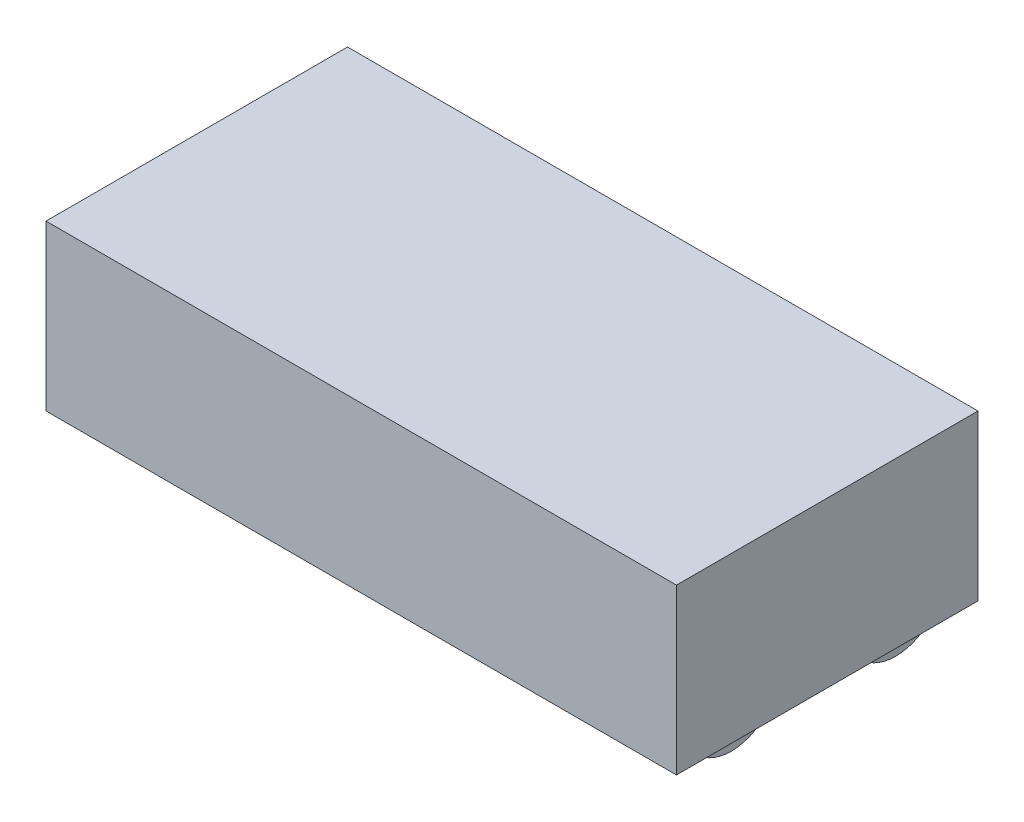
ISO-10303-21;
HEADER;
FILE_DESCRIPTION(('STEP AP214'),'2;1');
FILE_NAME('part.step','',(''),(''),'','','');
FILE_SCHEMA(('AUTOMOTIVE_DESIGN { 1 0 10303 214 1 1 1 1 }'));
ENDSEC;
DATA;
#1=APPLICATION_CONTEXT('core data for automotive mechanical design processes');
#2=APPLICATION_PROTOCOL_DEFINITION('international standard','automotive_design',2000,#1);
#3=PRODUCT_CONTEXT('',#1,'mechanical');
#4=PRODUCT('Part','Part','',(#3));
#5=PRODUCT_RELATED_PRODUCT_CATEGORY('part','',(#4));
#6=PRODUCT_DEFINITION_FORMATION('','',#4);
#7=PRODUCT_DEFINITION_CONTEXT('part definition',#1,'design');
#8=PRODUCT_DEFINITION('design','',#6,#7);
#9=PRODUCT_DEFINITION_SHAPE('','',#8);
#10=(LENGTH_UNIT() NAMED_UNIT(*) SI_UNIT(.MILLI.,.METRE.));
#11=(NAMED_UNIT(*) PLANE_ANGLE_UNIT() SI_UNIT($,.RADIAN.));
#12=(NAMED_UNIT(*) SI_UNIT($,.STERADIAN.) SOLID_ANGLE_UNIT());
#13=UNCERTAINTY_MEASURE_WITH_UNIT(LENGTH_MEASURE(1.E-05),#10,'distance_accuracy_value','');
#14=(GEOMETRIC_REPRESENTATION_CONTEXT(3) GLOBAL_UNCERTAINTY_ASSIGNED_CONTEXT((#13)) GLOBAL_UNIT_ASSIGNED_CONTEXT((#10,
#11,#12)) REPRESENTATION_CONTEXT('',''));
#15=CARTESIAN_POINT('',(0.,0.,0.));
#16=DIRECTION('',(0.,0.,1.));
#17=DIRECTION('',(1.,0.,0.));
#18=AXIS2_PLACEMENT_3D('',#15,#16,#17);
#19=CARTESIAN_POINT('',(0.,0.,0.));
#20=DIRECTION('',(0.,-1.,0.));
#21=DIRECTION('',(0.,0.,-1.));
#22=AXIS2_PLACEMENT_3D('',#19,#20,#21);
#23=PLANE('',#22);
#24=DIRECTION('',(0.,0.,-1.));
#25=VECTOR('',#24,1.);
#26=CARTESIAN_POINT('',(-292.1,0.,139.7));
#27=LINE('',#26,#25);
#28=CARTESIAN_POINT('',(-292.1,0.,139.7));
#29=VERTEX_POINT('',#28);
#30=CARTESIAN_POINT('',(-292.1,0.,-139.7));
#31=VERTEX_POINT('',#30);
#32=EDGE_CURVE('E190',#29,#31,#27,.T.);
#33=ORIENTED_EDGE('',*,*,#32,.T.);
#34=DIRECTION('',(1.,0.,0.));
#35=VECTOR('',#34,1.);
#36=CARTESIAN_POINT('',(-292.1,0.,-139.7));
#37=LINE('',#36,#35);
#38=CARTESIAN_POINT('',(292.1,0.,-139.7));
#39=VERTEX_POINT('',#38);
#40=EDGE_CURVE('E187',#31,#39,#37,.T.);
#41=ORIENTED_EDGE('',*,*,#40,.T.);
#42=DIRECTION('',(0.,0.,-1.));
#43=VECTOR('',#42,1.);
#44=CARTESIAN_POINT('',(292.1,0.,139.7));
#45=LINE('',#44,#43);
#46=CARTESIAN_POINT('',(292.1,0.,139.7));
#47=VERTEX_POINT('',#46);
#48=EDGE_CURVE('E184',#47,#39,#45,.T.);
#49=ORIENTED_EDGE('',*,*,#48,.F.);
#50=DIRECTION('',(1.,0.,0.));
#51=VECTOR('',#50,1.);
#52=CARTESIAN_POINT('',(-292.1,0.,139.7));
#53=LINE('',#52,#51);
#54=EDGE_CURVE('E181',#29,#47,#53,.T.);
#55=ORIENTED_EDGE('',*,*,#54,.F.);
#56=EDGE_LOOP('',(#33,#41,#49,#55));
#57=FACE_BOUND('',#56,.T.);
#58=DIRECTION('',(-1.,0.,0.));
#59=VECTOR('',#58,1.);
#60=CARTESIAN_POINT('',(-279.4,0.,39.7220271944835));
#61=LINE('',#60,#59);
#62=CARTESIAN_POINT('',(-234.95,0.,39.7220271944835));
#63=VERTEX_POINT('',#62);
#64=CARTESIAN_POINT('',(-279.4,0.,39.7220271944835));
#65=VERTEX_POINT('',#64);
#66=EDGE_CURVE('E165',#63,#65,#61,.T.);
#67=ORIENTED_EDGE('',*,*,#66,.T.);
#68=DIRECTION('',(0.,0.,1.));
#69=VECTOR('',#68,1.);
#70=CARTESIAN_POINT('',(-279.4,0.,0.));
#71=LINE('',#70,#69);
#72=CARTESIAN_POINT('',(-279.4,0.,112.677972805516));
#73=VERTEX_POINT('',#72);
#74=EDGE_CURVE('E159',#65,#73,#71,.T.);
#75=ORIENTED_EDGE('',*,*,#74,.T.);
#76=DIRECTION('',(-1.,0.,0.));
#77=VECTOR('',#76,1.);
#78=CARTESIAN_POINT('',(-279.4,0.,112.677972805516));
#79=LINE('',#78,#77);
#80=CARTESIAN_POINT('',(-234.95,0.,112.677972805516));
#81=VERTEX_POINT('',#80);
#82=EDGE_CURVE('E162',#73,#81,#79,.F.);
#83=ORIENTED_EDGE('',*,*,#82,.T.);
#84=DIRECTION('',(0.,0.,-1.));
#85=VECTOR('',#84,1.);
#86=CARTESIAN_POINT('',(-234.95,0.,0.));
#87=LINE('',#86,#85);
#88=EDGE_CURVE('E168',#81,#63,#87,.T.);
#89=ORIENTED_EDGE('',*,*,#88,.T.);
#90=EDGE_LOOP('',(#67,#75,#83,#89));
#91=FACE_BOUND('',#90,.T.);
#92=DIRECTION('',(-1.,0.,0.));
#93=VECTOR('',#92,1.);
#94=CARTESIAN_POINT('',(-279.4,0.,-112.677972805516));
#95=LINE('',#94,#93);
#96=CARTESIAN_POINT('',(-234.95,0.,-112.677972805516));
#97=VERTEX_POINT('',#96);
#98=CARTESIAN_POINT('',(-279.4,0.,-112.677972805516));
#99=VERTEX_POINT('',#98);
#100=EDGE_CURVE('E153',#97,#99,#95,.T.);
#101=ORIENTED_EDGE('',*,*,#100,.T.);
#102=DIRECTION('',(0.,0.,1.));
#103=VECTOR('',#102,1.);
#104=CARTESIAN_POINT('',(-279.4,0.,0.));
#105=LINE('',#104,#103);
#106=CARTESIAN_POINT('',(-279.4,0.,-39.7220271944835));
#107=VERTEX_POINT('',#106);
#108=EDGE_CURVE('E147',#99,#107,#105,.T.);
#109=ORIENTED_EDGE('',*,*,#108,.T.);
#110=DIRECTION('',(-1.,0.,0.));
#111=VECTOR('',#110,1.);
#112=CARTESIAN_POINT('',(-279.4,0.,-39.7220271944835));
#113=LINE('',#112,#111);
#114=CARTESIAN_POINT('',(-234.95,0.,-39.7220271944835));
#115=VERTEX_POINT('',#114);
#116=EDGE_CURVE('E150',#107,#115,#113,.F.);
#117=ORIENTED_EDGE('',*,*,#116,.T.);
#118=DIRECTION('',(0.,0.,-1.));
#119=VECTOR('',#118,1.);
#120=CARTESIAN_POINT('',(-234.95,0.,0.));
#121=LINE('',#120,#119);
#122=EDGE_CURVE('E156',#115,#97,#121,.T.);
#123=ORIENTED_EDGE('',*,*,#122,.T.);
#124=EDGE_LOOP('',(#101,#109,#117,#123));
#125=FACE_BOUND('',#124,.T.);
#126=DIRECTION('',(1.,0.,0.));
#127=VECTOR('',#126,1.);
#128=CARTESIAN_POINT('',(279.4,0.,112.677972805516));
#129=LINE('',#128,#127);
#130=CARTESIAN_POINT('',(234.95,0.,112.677972805516));
#131=VERTEX_POINT('',#130);
#132=CARTESIAN_POINT('',(279.4,0.,112.677972805516));
#133=VERTEX_POINT('',#132);
#134=EDGE_CURVE('E141',#131,#133,#129,.T.);
#135=ORIENTED_EDGE('',*,*,#134,.T.);
#136=DIRECTION('',(0.,0.,-1.));
#137=VECTOR('',#136,1.);
#138=CARTESIAN_POINT('',(279.4,0.,0.));
#139=LINE('',#138,#137);
#140=CARTESIAN_POINT('',(279.4,0.,39.7220271944835));
#141=VERTEX_POINT('',#140);
#142=EDGE_CURVE('E126',#133,#141,#139,.T.);
#143=ORIENTED_EDGE('',*,*,#142,.T.);
#144=DIRECTION('',(1.,0.,0.));
#145=VECTOR('',#144,1.);
#146=CARTESIAN_POINT('',(279.4,0.,39.7220271944835));
#147=LINE('',#146,#145);
#148=CARTESIAN_POINT('',(234.95,0.,39.7220271944835));
#149=VERTEX_POINT('',#148);
#150=EDGE_CURVE('E138',#141,#149,#147,.F.);
#151=ORIENTED_EDGE('',*,*,#150,.T.);
#152=DIRECTION('',(0.,0.,1.));
#153=VECTOR('',#152,1.);
#154=CARTESIAN_POINT('',(234.95,0.,0.));
#155=LINE('',#154,#153);
#156=EDGE_CURVE('E144',#149,#131,#155,.T.);
#157=ORIENTED_EDGE('',*,*,#156,.T.);
#158=EDGE_LOOP('',(#135,#143,#151,#157));
#159=FACE_BOUND('',#158,.T.);
#160=DIRECTION('',(1.,0.,0.));
#161=VECTOR('',#160,1.);
#162=CARTESIAN_POINT('',(279.4,0.,-39.7220271944835));
#163=LINE('',#162,#161);
#164=CARTESIAN_POINT('',(234.95,0.,-39.7220271944835));
#165=VERTEX_POINT('',#164);
#166=CARTESIAN_POINT('',(279.4,0.,-39.7220271944835));
#167=VERTEX_POINT('',#166);
#168=EDGE_CURVE('E125',#165,#167,#163,.T.);
#169=ORIENTED_EDGE('',*,*,#168,.T.);
#170=DIRECTION('',(0.,0.,-1.));
#171=VECTOR('',#170,1.);
#172=CARTESIAN_POINT('',(279.4,0.,0.));
#173=LINE('',#172,#171);
#174=CARTESIAN_POINT('',(279.4,0.,-112.677972805516));
#175=VERTEX_POINT('',#174);
#176=EDGE_CURVE('E11',#167,#175,#173,.T.);
#177=ORIENTED_EDGE('',*,*,#176,.T.);
#178=DIRECTION('',(1.,0.,0.));
#179=VECTOR('',#178,1.);
#180=CARTESIAN_POINT('',(279.4,0.,-112.677972805516));
#181=LINE('',#180,#179);
#182=CARTESIAN_POINT('',(234.95,0.,-112.677972805516));
#183=VERTEX_POINT('',#182);
#184=EDGE_CURVE('E41',#175,#183,#181,.F.);
#185=ORIENTED_EDGE('',*,*,#184,.T.);
#186=DIRECTION('',(0.,0.,1.));
#187=VECTOR('',#186,1.);
#188=CARTESIAN_POINT('',(234.95,0.,0.));
#189=LINE('',#188,#187);
#190=EDGE_CURVE('E120',#183,#165,#189,.T.);
#191=ORIENTED_EDGE('',*,*,#190,.T.);
#192=EDGE_LOOP('',(#169,#177,#185,#191));
#193=FACE_BOUND('',#192,.T.);
#194=ADVANCED_FACE('F33',(#57,#91,#125,#159,#193),#23,.T.);
#195=CARTESIAN_POINT('',(-292.1,152.4,139.7));
#196=DIRECTION('',(-1.,0.,0.));
#197=DIRECTION('',(0.,0.,1.));
#198=AXIS2_PLACEMENT_3D('',#195,#196,#197);
#199=PLANE('',#198);
#200=ORIENTED_EDGE('',*,*,#32,.F.);
#201=DIRECTION('',(0.,-1.,0.));
#202=VECTOR('',#201,1.);
#203=CARTESIAN_POINT('',(-292.1,152.4,139.7));
#204=LINE('',#203,#202);
#205=CARTESIAN_POINT('',(-292.1,152.4,139.7));
#206=VERTEX_POINT('',#205);
#207=EDGE_CURVE('E171',#206,#29,#204,.T.);
#208=ORIENTED_EDGE('',*,*,#207,.F.);
#209=DIRECTION('',(0.,0.,-1.));
#210=VECTOR('',#209,1.);
#211=CARTESIAN_POINT('',(-292.1,152.4,139.7));
#212=LINE('',#211,#210);
#213=CARTESIAN_POINT('',(-292.1,152.4,-139.7));
#214=VERTEX_POINT('',#213);
#215=EDGE_CURVE('E183',#206,#214,#212,.T.);
#216=ORIENTED_EDGE('',*,*,#215,.T.);
#217=DIRECTION('',(0.,-1.,0.));
#218=VECTOR('',#217,1.);
#219=CARTESIAN_POINT('',(-292.1,152.4,-139.7));
#220=LINE('',#219,#218);
#221=EDGE_CURVE('E172',#214,#31,#220,.T.);
#222=ORIENTED_EDGE('',*,*,#221,.T.);
#223=EDGE_LOOP('',(#200,#208,#216,#222));
#224=FACE_BOUND('',#223,.T.);
#225=ADVANCED_FACE('F35',(#224),#199,.T.);
#226=CARTESIAN_POINT('',(-292.1,152.4,139.7));
#227=DIRECTION('',(0.,0.,-1.));
#228=DIRECTION('',(-1.,0.,0.));
#229=AXIS2_PLACEMENT_3D('',#226,#227,#228);
#230=PLANE('',#229);
#231=ORIENTED_EDGE('',*,*,#54,.T.);
#232=DIRECTION('',(0.,-1.,0.));
#233=VECTOR('',#232,1.);
#234=CARTESIAN_POINT('',(292.1,152.4,139.7));
#235=LINE('',#234,#233);
#236=CARTESIAN_POINT('',(292.1,152.4,139.7));
#237=VERTEX_POINT('',#236);
#238=EDGE_CURVE('E177',#237,#47,#235,.T.);
#239=ORIENTED_EDGE('',*,*,#238,.F.);
#240=DIRECTION('',(1.,0.,0.));
#241=VECTOR('',#240,1.);
#242=CARTESIAN_POINT('',(-292.1,152.4,139.7));
#243=LINE('',#242,#241);
#244=EDGE_CURVE('E175',#206,#237,#243,.T.);
#245=ORIENTED_EDGE('',*,*,#244,.F.);
#246=ORIENTED_EDGE('',*,*,#207,.T.);
#247=EDGE_LOOP('',(#231,#239,#245,#246));
#248=FACE_BOUND('',#247,.T.);
#249=ADVANCED_FACE('F234',(#248),#230,.F.);
#250=CARTESIAN_POINT('',(292.1,152.4,139.7));
#251=DIRECTION('',(-1.,0.,0.));
#252=DIRECTION('',(0.,0.,1.));
#253=AXIS2_PLACEMENT_3D('',#250,#251,#252);
#254=PLANE('',#253);
#255=ORIENTED_EDGE('',*,*,#48,.T.);
#256=DIRECTION('',(0.,-1.,0.));
#257=VECTOR('',#256,1.);
#258=CARTESIAN_POINT('',(292.1,152.4,-139.7));
#259=LINE('',#258,#257);
#260=CARTESIAN_POINT('',(292.1,152.4,-139.7));
#261=VERTEX_POINT('',#260);
#262=EDGE_CURVE('E174',#261,#39,#259,.T.);
#263=ORIENTED_EDGE('',*,*,#262,.F.);
#264=DIRECTION('',(0.,0.,-1.));
#265=VECTOR('',#264,1.);
#266=CARTESIAN_POINT('',(292.1,152.4,139.7));
#267=LINE('',#266,#265);
#268=EDGE_CURVE('E195',#237,#261,#267,.T.);
#269=ORIENTED_EDGE('',*,*,#268,.F.);
#270=ORIENTED_EDGE('',*,*,#238,.T.);
#271=EDGE_LOOP('',(#255,#263,#269,#270));
#272=FACE_BOUND('',#271,.T.);
#273=ADVANCED_FACE('F243',(#272),#254,.F.);
#274=CARTESIAN_POINT('',(-292.1,152.4,-139.7));
#275=DIRECTION('',(0.,0.,-1.));
#276=DIRECTION('',(-1.,0.,0.));
#277=AXIS2_PLACEMENT_3D('',#274,#275,#276);
#278=PLANE('',#277);
#279=ORIENTED_EDGE('',*,*,#40,.F.);
#280=ORIENTED_EDGE('',*,*,#221,.F.);
#281=DIRECTION('',(1.,0.,0.));
#282=VECTOR('',#281,1.);
#283=CARTESIAN_POINT('',(-292.1,152.4,-139.7));
#284=LINE('',#283,#282);
#285=EDGE_CURVE('E197',#214,#261,#284,.T.);
#286=ORIENTED_EDGE('',*,*,#285,.T.);
#287=ORIENTED_EDGE('',*,*,#262,.T.);
#288=EDGE_LOOP('',(#279,#280,#286,#287));
#289=FACE_BOUND('',#288,.T.);
#290=ADVANCED_FACE('F246',(#289),#278,.T.);
#291=CARTESIAN_POINT('',(0.,152.4,0.));
#292=DIRECTION('',(0.,-1.,0.));
#293=DIRECTION('',(0.,0.,-1.));
#294=AXIS2_PLACEMENT_3D('',#291,#292,#293);
#295=PLANE('',#294);
#296=ORIENTED_EDGE('',*,*,#215,.F.);
#297=ORIENTED_EDGE('',*,*,#244,.T.);
#298=ORIENTED_EDGE('',*,*,#268,.T.);
#299=ORIENTED_EDGE('',*,*,#285,.F.);
#300=EDGE_LOOP('',(#296,#297,#298,#299));
#301=FACE_BOUND('',#300,.T.);
#302=ADVANCED_FACE('F239',(#301),#295,.F.);
#303=CARTESIAN_POINT('',(-279.4,25.4,76.2));
#304=DIRECTION('',(1.,0.,0.));
#305=DIRECTION('',(0.,0.,-1.));
#306=AXIS2_PLACEMENT_3D('',#303,#304,#305);
#307=PLANE('',#306);
#308=ORIENTED_EDGE('',*,*,#74,.F.);
#309=CARTESIAN_POINT('',(-279.4,25.4,76.2));
#310=DIRECTION('',(-1.,0.,0.));
#311=DIRECTION('',(0.,0.,1.));
#312=AXIS2_PLACEMENT_3D('',#309,#310,#311);
#313=CIRCLE('',#312,44.45);
#314=EDGE_CURVE('E193',#65,#73,#313,.T.);
#315=ORIENTED_EDGE('',*,*,#314,.T.);
#316=EDGE_LOOP('',(#308,#315));
#317=FACE_BOUND('',#316,.T.);
#318=ADVANCED_FACE('F253',(#317),#307,.F.);
#319=CARTESIAN_POINT('',(-279.4,25.4,76.2));
#320=DIRECTION('',(-1.,0.,0.));
#321=DIRECTION('',(0.,0.,1.));
#322=AXIS2_PLACEMENT_3D('',#319,#320,#321);
#323=CYLINDRICAL_SURFACE('',#322,44.45);
#324=ORIENTED_EDGE('',*,*,#82,.F.);
#325=ORIENTED_EDGE('',*,*,#314,.F.);
#326=ORIENTED_EDGE('',*,*,#66,.F.);
#327=CARTESIAN_POINT('',(-234.95,25.4,76.2));
#328=DIRECTION('',(-1.,0.,0.));
#329=DIRECTION('',(0.,0.,1.));
#330=AXIS2_PLACEMENT_3D('',#327,#328,#329);
#331=CIRCLE('',#330,44.45);
#332=EDGE_CURVE('E204',#63,#81,#331,.T.);
#333=ORIENTED_EDGE('',*,*,#332,.T.);
#334=EDGE_LOOP('',(#324,#325,#326,#333));
#335=FACE_BOUND('',#334,.T.);
#336=ADVANCED_FACE('F268',(#335),#323,.T.);
#337=CARTESIAN_POINT('',(-234.95,25.4,76.2));
#338=DIRECTION('',(-1.,0.,0.));
#339=DIRECTION('',(0.,0.,1.));
#340=AXIS2_PLACEMENT_3D('',#337,#338,#339);
#341=PLANE('',#340);
#342=ORIENTED_EDGE('',*,*,#88,.F.);
#343=ORIENTED_EDGE('',*,*,#332,.F.);
#344=EDGE_LOOP('',(#342,#343));
#345=FACE_BOUND('',#344,.T.);
#346=ADVANCED_FACE('F273',(#345),#341,.F.);
#347=CARTESIAN_POINT('',(-279.4,25.4,-76.2));
#348=DIRECTION('',(1.,0.,0.));
#349=DIRECTION('',(0.,0.,1.));
#350=AXIS2_PLACEMENT_3D('',#347,#348,#349);
#351=PLANE('',#350);
#352=ORIENTED_EDGE('',*,*,#108,.F.);
#353=CARTESIAN_POINT('',(-279.4,25.4,-76.2));
#354=DIRECTION('',(1.,0.,0.));
#355=DIRECTION('',(0.,0.,-1.));
#356=AXIS2_PLACEMENT_3D('',#353,#354,#355);
#357=CIRCLE('',#356,44.45);
#358=EDGE_CURVE('E207',#107,#99,#357,.T.);
#359=ORIENTED_EDGE('',*,*,#358,.F.);
#360=EDGE_LOOP('',(#352,#359));
#361=FACE_BOUND('',#360,.T.);
#362=ADVANCED_FACE('F279',(#361),#351,.F.);
#363=CARTESIAN_POINT('',(-279.4,25.4,-76.2));
#364=DIRECTION('',(-1.,0.,0.));
#365=DIRECTION('',(0.,0.,-1.));
#366=AXIS2_PLACEMENT_3D('',#363,#364,#365);
#367=CYLINDRICAL_SURFACE('',#366,44.45);
#368=ORIENTED_EDGE('',*,*,#116,.F.);
#369=ORIENTED_EDGE('',*,*,#358,.T.);
#370=ORIENTED_EDGE('',*,*,#100,.F.);
#371=CARTESIAN_POINT('',(-234.95,25.4,-76.2));
#372=DIRECTION('',(1.,0.,0.));
#373=DIRECTION('',(0.,0.,-1.));
#374=AXIS2_PLACEMENT_3D('',#371,#372,#373);
#375=CIRCLE('',#374,44.45);
#376=EDGE_CURVE('E210',#115,#97,#375,.T.);
#377=ORIENTED_EDGE('',*,*,#376,.F.);
#378=EDGE_LOOP('',(#368,#369,#370,#377));
#379=FACE_BOUND('',#378,.T.);
#380=ADVANCED_FACE('F283',(#379),#367,.T.);
#381=CARTESIAN_POINT('',(-234.95,25.4,-76.2));
#382=DIRECTION('',(-1.,0.,0.));
#383=DIRECTION('',(0.,0.,-1.));
#384=AXIS2_PLACEMENT_3D('',#381,#382,#383);
#385=PLANE('',#384);
#386=ORIENTED_EDGE('',*,*,#122,.F.);
#387=ORIENTED_EDGE('',*,*,#376,.T.);
#388=EDGE_LOOP('',(#386,#387));
#389=FACE_BOUND('',#388,.T.);
#390=ADVANCED_FACE('F287',(#389),#385,.F.);
#391=CARTESIAN_POINT('',(279.4,25.4,76.2));
#392=DIRECTION('',(-1.,0.,0.));
#393=DIRECTION('',(0.,0.,-1.));
#394=AXIS2_PLACEMENT_3D('',#391,#392,#393);
#395=PLANE('',#394);
#396=ORIENTED_EDGE('',*,*,#142,.F.);
#397=CARTESIAN_POINT('',(279.4,25.4,76.2));
#398=DIRECTION('',(-1.,0.,0.));
#399=DIRECTION('',(0.,0.,1.));
#400=AXIS2_PLACEMENT_3D('',#397,#398,#399);
#401=CIRCLE('',#400,44.45);
#402=EDGE_CURVE('E212',#141,#133,#401,.T.);
#403=ORIENTED_EDGE('',*,*,#402,.F.);
#404=EDGE_LOOP('',(#396,#403));
#405=FACE_BOUND('',#404,.T.);
#406=ADVANCED_FACE('F291',(#405),#395,.F.);
#407=CARTESIAN_POINT('',(279.4,25.4,76.2));
#408=DIRECTION('',(1.,0.,0.));
#409=DIRECTION('',(0.,0.,1.));
#410=AXIS2_PLACEMENT_3D('',#407,#408,#409);
#411=CYLINDRICAL_SURFACE('',#410,44.45);
#412=ORIENTED_EDGE('',*,*,#150,.F.);
#413=ORIENTED_EDGE('',*,*,#402,.T.);
#414=ORIENTED_EDGE('',*,*,#134,.F.);
#415=CARTESIAN_POINT('',(234.95,25.4,76.2));
#416=DIRECTION('',(-1.,0.,0.));
#417=DIRECTION('',(0.,0.,1.));
#418=AXIS2_PLACEMENT_3D('',#415,#416,#417);
#419=CIRCLE('',#418,44.45);
#420=EDGE_CURVE('E54',#149,#131,#419,.T.);
#421=ORIENTED_EDGE('',*,*,#420,.F.);
#422=EDGE_LOOP('',(#412,#413,#414,#421));
#423=FACE_BOUND('',#422,.T.);
#424=ADVANCED_FACE('F226',(#423),#411,.T.);
#425=CARTESIAN_POINT('',(234.95,25.4,76.2));
#426=DIRECTION('',(1.,0.,0.));
#427=DIRECTION('',(0.,0.,1.));
#428=AXIS2_PLACEMENT_3D('',#425,#426,#427);
#429=PLANE('',#428);
#430=ORIENTED_EDGE('',*,*,#156,.F.);
#431=ORIENTED_EDGE('',*,*,#420,.T.);
#432=EDGE_LOOP('',(#430,#431));
#433=FACE_BOUND('',#432,.T.);
#434=ADVANCED_FACE('F219',(#433),#429,.F.);
#435=CARTESIAN_POINT('',(279.4,25.4,-76.2));
#436=DIRECTION('',(-1.,0.,0.));
#437=DIRECTION('',(0.,0.,1.));
#438=AXIS2_PLACEMENT_3D('',#435,#436,#437);
#439=PLANE('',#438);
#440=ORIENTED_EDGE('',*,*,#176,.F.);
#441=CARTESIAN_POINT('',(279.4,25.4,-76.2));
#442=DIRECTION('',(1.,0.,0.));
#443=DIRECTION('',(0.,0.,-1.));
#444=AXIS2_PLACEMENT_3D('',#441,#442,#443);
#445=CIRCLE('',#444,44.45);
#446=EDGE_CURVE('E132',#167,#175,#445,.T.);
#447=ORIENTED_EDGE('',*,*,#446,.T.);
#448=EDGE_LOOP('',(#440,#447));
#449=FACE_BOUND('',#448,.T.);
#450=ADVANCED_FACE('F217',(#449),#439,.F.);
#451=CARTESIAN_POINT('',(279.4,25.4,-76.2));
#452=DIRECTION('',(1.,0.,0.));
#453=DIRECTION('',(0.,0.,-1.));
#454=AXIS2_PLACEMENT_3D('',#451,#452,#453);
#455=CYLINDRICAL_SURFACE('',#454,44.45);
#456=ORIENTED_EDGE('',*,*,#184,.F.);
#457=ORIENTED_EDGE('',*,*,#446,.F.);
#458=ORIENTED_EDGE('',*,*,#168,.F.);
#459=CARTESIAN_POINT('',(234.95,25.4,-76.2));
#460=DIRECTION('',(1.,0.,0.));
#461=DIRECTION('',(0.,0.,-1.));
#462=AXIS2_PLACEMENT_3D('',#459,#460,#461);
#463=CIRCLE('',#462,44.45);
#464=EDGE_CURVE('E47',#165,#183,#463,.T.);
#465=ORIENTED_EDGE('',*,*,#464,.T.);
#466=EDGE_LOOP('',(#456,#457,#458,#465));
#467=FACE_BOUND('',#466,.T.);
#468=ADVANCED_FACE('F129',(#467),#455,.T.);
#469=CARTESIAN_POINT('',(234.95,25.4,-76.2));
#470=DIRECTION('',(1.,0.,0.));
#471=DIRECTION('',(0.,0.,-1.));
#472=AXIS2_PLACEMENT_3D('',#469,#470,#471);
#473=PLANE('',#472);
#474=ORIENTED_EDGE('',*,*,#190,.F.);
#475=ORIENTED_EDGE('',*,*,#464,.F.);
#476=EDGE_LOOP('',(#474,#475));
#477=FACE_BOUND('',#476,.T.);
#478=ADVANCED_FACE('F121',(#477),#473,.F.);
#479=CLOSED_SHELL('',(#194,#225,#249,#273,#290,#302,#318,#336,#346,#362,#380,#390,#406,#424,
#434,#450,#468,#478));
#480=MANIFOLD_SOLID_BREP('B2',#479);
#481=ADVANCED_BREP_SHAPE_REPRESENTATION('',(#18,#480),#14);
#482=SHAPE_DEFINITION_REPRESENTATION(#9,#481);
ENDSEC;
END-ISO-10303-21;
